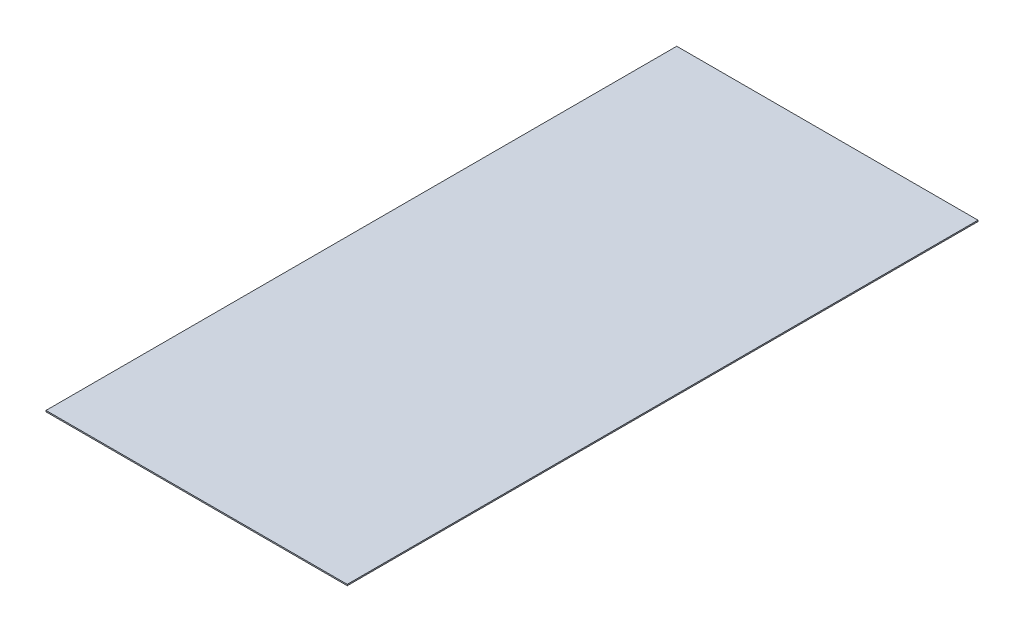
ISO-10303-21;
HEADER;
FILE_DESCRIPTION(('STEP AP214'),'2;1');
FILE_NAME('part.step','',(''),(''),'','','');
FILE_SCHEMA(('AUTOMOTIVE_DESIGN { 1 0 10303 214 1 1 1 1 }'));
ENDSEC;
DATA;
#1=APPLICATION_CONTEXT('core data for automotive mechanical design processes');
#2=APPLICATION_PROTOCOL_DEFINITION('international standard','automotive_design',2000,#1);
#3=PRODUCT_CONTEXT('',#1,'mechanical');
#4=PRODUCT('Part','Part','',(#3));
#5=PRODUCT_RELATED_PRODUCT_CATEGORY('part','',(#4));
#6=PRODUCT_DEFINITION_FORMATION('','',#4);
#7=PRODUCT_DEFINITION_CONTEXT('part definition',#1,'design');
#8=PRODUCT_DEFINITION('design','',#6,#7);
#9=PRODUCT_DEFINITION_SHAPE('','',#8);
#10=(LENGTH_UNIT() NAMED_UNIT(*) SI_UNIT(.MILLI.,.METRE.));
#11=(NAMED_UNIT(*) PLANE_ANGLE_UNIT() SI_UNIT($,.RADIAN.));
#12=(NAMED_UNIT(*) SI_UNIT($,.STERADIAN.) SOLID_ANGLE_UNIT());
#13=UNCERTAINTY_MEASURE_WITH_UNIT(LENGTH_MEASURE(1.E-05),#10,'distance_accuracy_value','');
#14=(GEOMETRIC_REPRESENTATION_CONTEXT(3) GLOBAL_UNCERTAINTY_ASSIGNED_CONTEXT((#13)) GLOBAL_UNIT_ASSIGNED_CONTEXT((#10,
#11,#12)) REPRESENTATION_CONTEXT('',''));
#15=CARTESIAN_POINT('',(0.,0.,0.));
#16=DIRECTION('',(0.,0.,1.));
#17=DIRECTION('',(1.,0.,0.));
#18=AXIS2_PLACEMENT_3D('',#15,#16,#17);
#19=CARTESIAN_POINT('',(-24.,0.,50.25));
#20=DIRECTION('',(0.,1.,0.));
#21=DIRECTION('',(0.,0.,1.));
#22=AXIS2_PLACEMENT_3D('',#19,#20,#21);
#23=PLANE('',#22);
#24=DIRECTION('',(0.,0.,-1.));
#25=VECTOR('',#24,1.);
#26=CARTESIAN_POINT('',(24.,0.,-50.25));
#27=LINE('',#26,#25);
#28=CARTESIAN_POINT('',(24.,0.,-50.25));
#29=VERTEX_POINT('',#28);
#30=CARTESIAN_POINT('',(24.,0.,50.25));
#31=VERTEX_POINT('',#30);
#32=EDGE_CURVE('E58',#29,#31,#27,.F.);
#33=ORIENTED_EDGE('',*,*,#32,.F.);
#34=DIRECTION('',(-1.,0.,0.));
#35=VECTOR('',#34,1.);
#36=CARTESIAN_POINT('',(-24.,0.,-50.25));
#37=LINE('',#36,#35);
#38=CARTESIAN_POINT('',(-24.,0.,-50.25));
#39=VERTEX_POINT('',#38);
#40=EDGE_CURVE('E53',#39,#29,#37,.F.);
#41=ORIENTED_EDGE('',*,*,#40,.F.);
#42=DIRECTION('',(0.,0.,1.));
#43=VECTOR('',#42,1.);
#44=CARTESIAN_POINT('',(-24.,0.,-50.25));
#45=LINE('',#44,#43);
#46=CARTESIAN_POINT('',(-24.,0.,50.25));
#47=VERTEX_POINT('',#46);
#48=EDGE_CURVE('E68',#47,#39,#45,.F.);
#49=ORIENTED_EDGE('',*,*,#48,.F.);
#50=DIRECTION('',(1.,0.,0.));
#51=VECTOR('',#50,1.);
#52=CARTESIAN_POINT('',(-24.,0.,50.25));
#53=LINE('',#52,#51);
#54=EDGE_CURVE('E20',#31,#47,#53,.F.);
#55=ORIENTED_EDGE('',*,*,#54,.F.);
#56=EDGE_LOOP('',(#33,#41,#49,#55));
#57=FACE_BOUND('',#56,.T.);
#58=ADVANCED_FACE('F17',(#57),#23,.T.);
#59=CARTESIAN_POINT('',(-24.,-0.2,50.25));
#60=DIRECTION('',(0.,0.,1.));
#61=DIRECTION('',(1.,0.,0.));
#62=AXIS2_PLACEMENT_3D('',#59,#60,#61);
#63=PLANE('',#62);
#64=DIRECTION('',(1.,0.,0.));
#65=VECTOR('',#64,1.);
#66=CARTESIAN_POINT('',(-24.,-0.2,50.25));
#67=LINE('',#66,#65);
#68=CARTESIAN_POINT('',(-24.,-0.2,50.25));
#69=VERTEX_POINT('',#68);
#70=CARTESIAN_POINT('',(24.,-0.2,50.25));
#71=VERTEX_POINT('',#70);
#72=EDGE_CURVE('E74',#69,#71,#67,.T.);
#73=ORIENTED_EDGE('',*,*,#72,.T.);
#74=DIRECTION('',(0.,1.,0.));
#75=VECTOR('',#74,1.);
#76=CARTESIAN_POINT('',(24.,-0.2,50.25));
#77=LINE('',#76,#75);
#78=EDGE_CURVE('E63',#31,#71,#77,.F.);
#79=ORIENTED_EDGE('',*,*,#78,.F.);
#80=ORIENTED_EDGE('',*,*,#54,.T.);
#81=DIRECTION('',(0.,1.,0.));
#82=VECTOR('',#81,1.);
#83=CARTESIAN_POINT('',(-24.,-0.2,50.25));
#84=LINE('',#83,#82);
#85=EDGE_CURVE('E81',#69,#47,#84,.T.);
#86=ORIENTED_EDGE('',*,*,#85,.F.);
#87=EDGE_LOOP('',(#73,#79,#80,#86));
#88=FACE_BOUND('',#87,.T.);
#89=ADVANCED_FACE('F73',(#88),#63,.T.);
#90=CARTESIAN_POINT('',(24.,-0.2,-50.25));
#91=DIRECTION('',(1.,0.,0.));
#92=DIRECTION('',(0.,0.,-1.));
#93=AXIS2_PLACEMENT_3D('',#90,#91,#92);
#94=PLANE('',#93);
#95=DIRECTION('',(0.,0.,1.));
#96=VECTOR('',#95,1.);
#97=CARTESIAN_POINT('',(24.,-0.2,50.25));
#98=LINE('',#97,#96);
#99=CARTESIAN_POINT('',(24.,-0.2,-50.25));
#100=VERTEX_POINT('',#99);
#101=EDGE_CURVE('E84',#71,#100,#98,.F.);
#102=ORIENTED_EDGE('',*,*,#101,.T.);
#103=DIRECTION('',(0.,1.,0.));
#104=VECTOR('',#103,1.);
#105=CARTESIAN_POINT('',(24.,-0.2,-50.25));
#106=LINE('',#105,#104);
#107=EDGE_CURVE('E65',#29,#100,#106,.F.);
#108=ORIENTED_EDGE('',*,*,#107,.F.);
#109=ORIENTED_EDGE('',*,*,#32,.T.);
#110=ORIENTED_EDGE('',*,*,#78,.T.);
#111=EDGE_LOOP('',(#102,#108,#109,#110));
#112=FACE_BOUND('',#111,.T.);
#113=ADVANCED_FACE('F61',(#112),#94,.T.);
#114=CARTESIAN_POINT('',(-24.,-0.2,-50.25));
#115=DIRECTION('',(0.,0.,-1.));
#116=DIRECTION('',(-1.,0.,0.));
#117=AXIS2_PLACEMENT_3D('',#114,#115,#116);
#118=PLANE('',#117);
#119=DIRECTION('',(1.,0.,0.));
#120=VECTOR('',#119,1.);
#121=CARTESIAN_POINT('',(-24.,-0.2,-50.25));
#122=LINE('',#121,#120);
#123=CARTESIAN_POINT('',(-24.,-0.2,-50.25));
#124=VERTEX_POINT('',#123);
#125=EDGE_CURVE('E26',#100,#124,#122,.F.);
#126=ORIENTED_EDGE('',*,*,#125,.T.);
#127=DIRECTION('',(0.,1.,0.));
#128=VECTOR('',#127,1.);
#129=CARTESIAN_POINT('',(-24.,-0.2,-50.25));
#130=LINE('',#129,#128);
#131=EDGE_CURVE('E34',#39,#124,#130,.F.);
#132=ORIENTED_EDGE('',*,*,#131,.F.);
#133=ORIENTED_EDGE('',*,*,#40,.T.);
#134=ORIENTED_EDGE('',*,*,#107,.T.);
#135=EDGE_LOOP('',(#126,#132,#133,#134));
#136=FACE_BOUND('',#135,.T.);
#137=ADVANCED_FACE('F88',(#136),#118,.T.);
#138=CARTESIAN_POINT('',(-24.,-0.2,-50.25));
#139=DIRECTION('',(-1.,0.,0.));
#140=DIRECTION('',(0.,0.,1.));
#141=AXIS2_PLACEMENT_3D('',#138,#139,#140);
#142=PLANE('',#141);
#143=DIRECTION('',(0.,0.,1.));
#144=VECTOR('',#143,1.);
#145=CARTESIAN_POINT('',(-24.,-0.2,50.25));
#146=LINE('',#145,#144);
#147=EDGE_CURVE('E11',#124,#69,#146,.T.);
#148=ORIENTED_EDGE('',*,*,#147,.T.);
#149=ORIENTED_EDGE('',*,*,#85,.T.);
#150=ORIENTED_EDGE('',*,*,#48,.T.);
#151=ORIENTED_EDGE('',*,*,#131,.T.);
#152=EDGE_LOOP('',(#148,#149,#150,#151));
#153=FACE_BOUND('',#152,.T.);
#154=ADVANCED_FACE('F91',(#153),#142,.T.);
#155=CARTESIAN_POINT('',(-24.,-0.2,50.25));
#156=DIRECTION('',(0.,1.,0.));
#157=DIRECTION('',(0.,0.,1.));
#158=AXIS2_PLACEMENT_3D('',#155,#156,#157);
#159=PLANE('',#158);
#160=ORIENTED_EDGE('',*,*,#125,.F.);
#161=ORIENTED_EDGE('',*,*,#101,.F.);
#162=ORIENTED_EDGE('',*,*,#72,.F.);
#163=ORIENTED_EDGE('',*,*,#147,.F.);
#164=EDGE_LOOP('',(#160,#161,#162,#163));
#165=FACE_BOUND('',#164,.T.);
#166=ADVANCED_FACE('F90',(#165),#159,.F.);
#167=CLOSED_SHELL('',(#58,#89,#113,#137,#154,#166));
#168=MANIFOLD_SOLID_BREP('B1',#167);
#169=ADVANCED_BREP_SHAPE_REPRESENTATION('',(#18,#168),#14);
#170=SHAPE_DEFINITION_REPRESENTATION(#9,#169);
ENDSEC;
END-ISO-10303-21;
